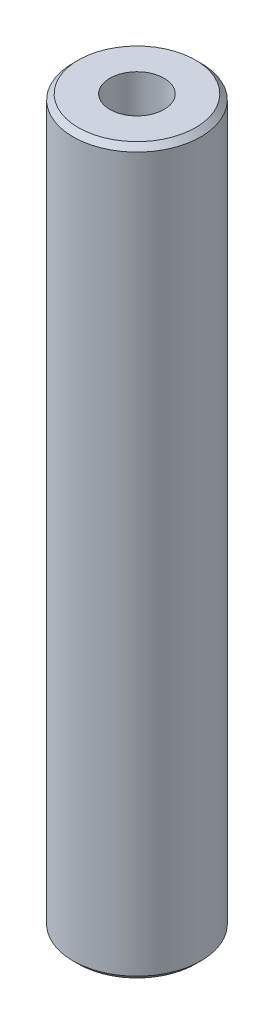
ISO-10303-21;
HEADER;
FILE_DESCRIPTION(('STEP AP214'),'2;1');
FILE_NAME('part.step','',(''),(''),'','','');
FILE_SCHEMA(('AUTOMOTIVE_DESIGN { 1 0 10303 214 1 1 1 1 }'));
ENDSEC;
DATA;
#1=APPLICATION_CONTEXT('core data for automotive mechanical design processes');
#2=APPLICATION_PROTOCOL_DEFINITION('international standard','automotive_design',2000,#1);
#3=PRODUCT_CONTEXT('',#1,'mechanical');
#4=PRODUCT('Part','Part','',(#3));
#5=PRODUCT_RELATED_PRODUCT_CATEGORY('part','',(#4));
#6=PRODUCT_DEFINITION_FORMATION('','',#4);
#7=PRODUCT_DEFINITION_CONTEXT('part definition',#1,'design');
#8=PRODUCT_DEFINITION('design','',#6,#7);
#9=PRODUCT_DEFINITION_SHAPE('','',#8);
#10=(LENGTH_UNIT() NAMED_UNIT(*) SI_UNIT(.MILLI.,.METRE.));
#11=(NAMED_UNIT(*) PLANE_ANGLE_UNIT() SI_UNIT($,.RADIAN.));
#12=(NAMED_UNIT(*) SI_UNIT($,.STERADIAN.) SOLID_ANGLE_UNIT());
#13=UNCERTAINTY_MEASURE_WITH_UNIT(LENGTH_MEASURE(1.E-05),#10,'distance_accuracy_value','');
#14=(GEOMETRIC_REPRESENTATION_CONTEXT(3) GLOBAL_UNCERTAINTY_ASSIGNED_CONTEXT((#13)) GLOBAL_UNIT_ASSIGNED_CONTEXT((#10,
#11,#12)) REPRESENTATION_CONTEXT('',''));
#15=CARTESIAN_POINT('',(0.,0.,0.));
#16=DIRECTION('',(0.,0.,1.));
#17=DIRECTION('',(1.,0.,0.));
#18=AXIS2_PLACEMENT_3D('',#15,#16,#17);
#19=CARTESIAN_POINT('',(0.,26.9875,0.));
#20=DIRECTION('',(0.,-1.,0.));
#21=DIRECTION('',(0.,0.,-1.));
#22=AXIS2_PLACEMENT_3D('',#19,#20,#21);
#23=CYLINDRICAL_SURFACE('',#22,4.7625);
#24=CARTESIAN_POINT('',(0.,-26.590625,0.));
#25=DIRECTION('',(0.,1.,0.));
#26=DIRECTION('',(0.,0.,1.));
#27=AXIS2_PLACEMENT_3D('',#24,#25,#26);
#28=CIRCLE('',#27,4.7625);
#29=CARTESIAN_POINT('',(0.,-26.590625,4.7625));
#30=VERTEX_POINT('',#29);
#31=EDGE_CURVE('E45',#30,#30,#28,.T.);
#32=ORIENTED_EDGE('',*,*,#31,.T.);
#33=EDGE_LOOP('',(#32));
#34=FACE_BOUND('',#33,.T.);
#35=CARTESIAN_POINT('',(0.,26.590625,0.));
#36=DIRECTION('',(0.,1.,0.));
#37=DIRECTION('',(0.,0.,1.));
#38=AXIS2_PLACEMENT_3D('',#35,#36,#37);
#39=CIRCLE('',#38,4.7625);
#40=CARTESIAN_POINT('',(0.,26.590625,4.7625));
#41=VERTEX_POINT('',#40);
#42=EDGE_CURVE('E49',#41,#41,#39,.F.);
#43=ORIENTED_EDGE('',*,*,#42,.T.);
#44=EDGE_LOOP('',(#43));
#45=FACE_BOUND('',#44,.T.);
#46=ADVANCED_FACE('F33',(#34,#45),#23,.T.);
#47=CARTESIAN_POINT('',(0.,26.9875,0.));
#48=DIRECTION('',(0.,1.,0.));
#49=DIRECTION('',(0.,0.,1.));
#50=AXIS2_PLACEMENT_3D('',#47,#48,#49);
#51=PLANE('',#50);
#52=CARTESIAN_POINT('',(0.,26.9875,0.));
#53=DIRECTION('',(0.,1.,0.));
#54=DIRECTION('',(0.,0.,1.));
#55=AXIS2_PLACEMENT_3D('',#52,#53,#54);
#56=CIRCLE('',#55,2.0193);
#57=CARTESIAN_POINT('',(0.,26.9875,2.0193));
#58=VERTEX_POINT('',#57);
#59=EDGE_CURVE('E55',#58,#58,#56,.T.);
#60=ORIENTED_EDGE('',*,*,#59,.F.);
#61=EDGE_LOOP('',(#60));
#62=FACE_BOUND('',#61,.T.);
#63=CARTESIAN_POINT('',(0.,26.9875,0.));
#64=DIRECTION('',(0.,1.,0.));
#65=DIRECTION('',(0.,0.,1.));
#66=AXIS2_PLACEMENT_3D('',#63,#64,#65);
#67=CIRCLE('',#66,4.36562499999998);
#68=CARTESIAN_POINT('',(0.,26.9875,4.36562499999998));
#69=VERTEX_POINT('',#68);
#70=EDGE_CURVE('E10',#69,#69,#67,.T.);
#71=ORIENTED_EDGE('',*,*,#70,.T.);
#72=EDGE_LOOP('',(#71));
#73=FACE_BOUND('',#72,.T.);
#74=ADVANCED_FACE('F79',(#62,#73),#51,.T.);
#75=CARTESIAN_POINT('',(0.,-26.9875,0.));
#76=DIRECTION('',(0.,1.,0.));
#77=DIRECTION('',(0.,0.,1.));
#78=AXIS2_PLACEMENT_3D('',#75,#76,#77);
#79=PLANE('',#78);
#80=CARTESIAN_POINT('',(0.,-26.9875,0.));
#81=DIRECTION('',(0.,1.,0.));
#82=DIRECTION('',(0.,0.,1.));
#83=AXIS2_PLACEMENT_3D('',#80,#81,#82);
#84=CIRCLE('',#83,2.0193);
#85=CARTESIAN_POINT('',(0.,-26.9875,-2.0193));
#86=VERTEX_POINT('',#85);
#87=EDGE_CURVE('E61',#86,#86,#84,.T.);
#88=ORIENTED_EDGE('',*,*,#87,.T.);
#89=EDGE_LOOP('',(#88));
#90=FACE_BOUND('',#89,.T.);
#91=CARTESIAN_POINT('',(0.,-26.9875,0.));
#92=DIRECTION('',(0.,1.,0.));
#93=DIRECTION('',(0.,0.,1.));
#94=AXIS2_PLACEMENT_3D('',#91,#92,#93);
#95=CIRCLE('',#94,4.36562499999999);
#96=CARTESIAN_POINT('',(0.,-26.9875,4.36562499999999));
#97=VERTEX_POINT('',#96);
#98=EDGE_CURVE('E41',#97,#97,#95,.F.);
#99=ORIENTED_EDGE('',*,*,#98,.T.);
#100=EDGE_LOOP('',(#99));
#101=FACE_BOUND('',#100,.T.);
#102=ADVANCED_FACE('F85',(#90,#101),#79,.F.);
#103=CARTESIAN_POINT('',(0.,-26.590625,0.));
#104=DIRECTION('',(0.,1.,0.));
#105=DIRECTION('',(0.,0.,1.));
#106=AXIS2_PLACEMENT_3D('',#103,#104,#105);
#107=CONICAL_SURFACE('',#106,4.7625,0.785398163397454);
#108=ORIENTED_EDGE('',*,*,#98,.F.);
#109=EDGE_LOOP('',(#108));
#110=FACE_BOUND('',#109,.T.);
#111=ORIENTED_EDGE('',*,*,#31,.F.);
#112=EDGE_LOOP('',(#111));
#113=FACE_BOUND('',#112,.T.);
#114=ADVANCED_FACE('F91',(#110,#113),#107,.T.);
#115=CARTESIAN_POINT('',(0.,26.9875,0.));
#116=DIRECTION('',(0.,-1.,0.));
#117=DIRECTION('',(0.,0.,-1.));
#118=AXIS2_PLACEMENT_3D('',#115,#116,#117);
#119=CONICAL_SURFACE('',#118,4.36562499999998,0.785398163397445);
#120=ORIENTED_EDGE('',*,*,#42,.F.);
#121=EDGE_LOOP('',(#120));
#122=FACE_BOUND('',#121,.T.);
#123=ORIENTED_EDGE('',*,*,#70,.F.);
#124=EDGE_LOOP('',(#123));
#125=FACE_BOUND('',#124,.T.);
#126=ADVANCED_FACE('F36',(#122,#125),#119,.T.);
#127=CARTESIAN_POINT('',(0.,7.9375,0.));
#128=DIRECTION('',(0.,1.,0.));
#129=DIRECTION('',(0.,0.,1.));
#130=AXIS2_PLACEMENT_3D('',#127,#128,#129);
#131=CYLINDRICAL_SURFACE('',#130,2.0193);
#132=CARTESIAN_POINT('',(0.,7.9375,0.));
#133=DIRECTION('',(0.,1.,0.));
#134=DIRECTION('',(0.,0.,1.));
#135=AXIS2_PLACEMENT_3D('',#132,#133,#134);
#136=CIRCLE('',#135,2.0193);
#137=CARTESIAN_POINT('',(0.,7.9375,2.0193));
#138=VERTEX_POINT('',#137);
#139=EDGE_CURVE('E54',#138,#138,#136,.T.);
#140=CARTESIAN_POINT('',(0.,7.9375,2.0193));
#141=CARTESIAN_POINT('',(0.,8.1359375,2.0193));
#142=CARTESIAN_POINT('',(0.,8.334375,2.0193));
#143=CARTESIAN_POINT('',(0.,8.73125,2.0193));
#144=CARTESIAN_POINT('',(0.,8.92968749999999,2.0193));
#145=CARTESIAN_POINT('',(0.,9.3265625,2.0193));
#146=CARTESIAN_POINT('',(0.,9.525,2.0193));
#147=CARTESIAN_POINT('',(0.,9.921875,2.0193));
#148=CARTESIAN_POINT('',(0.,10.1203125,2.0193));
#149=CARTESIAN_POINT('',(0.,10.5171875,2.0193));
#150=CARTESIAN_POINT('',(0.,10.715625,2.0193));
#151=CARTESIAN_POINT('',(0.,11.1125,2.0193));
#152=CARTESIAN_POINT('',(0.,11.3109375,2.0193));
#153=CARTESIAN_POINT('',(0.,11.7078125,2.0193));
#154=CARTESIAN_POINT('',(0.,11.90625,2.0193));
#155=CARTESIAN_POINT('',(0.,12.303125,2.0193));
#156=CARTESIAN_POINT('',(0.,12.5015625,2.0193));
#157=CARTESIAN_POINT('',(0.,12.8984375,2.0193));
#158=CARTESIAN_POINT('',(0.,13.096875,2.0193));
#159=CARTESIAN_POINT('',(0.,13.49375,2.0193));
#160=CARTESIAN_POINT('',(0.,13.6921875,2.0193));
#161=CARTESIAN_POINT('',(0.,14.0890625,2.0193));
#162=CARTESIAN_POINT('',(0.,14.2875,2.0193));
#163=CARTESIAN_POINT('',(0.,14.684375,2.0193));
#164=CARTESIAN_POINT('',(0.,14.8828125,2.0193));
#165=CARTESIAN_POINT('',(0.,15.2796875,2.0193));
#166=CARTESIAN_POINT('',(0.,15.478125,2.0193));
#167=CARTESIAN_POINT('',(0.,15.875,2.0193));
#168=CARTESIAN_POINT('',(0.,16.0734375,2.0193));
#169=CARTESIAN_POINT('',(0.,16.4703125,2.0193));
#170=CARTESIAN_POINT('',(0.,16.66875,2.0193));
#171=CARTESIAN_POINT('',(0.,17.065625,2.0193));
#172=CARTESIAN_POINT('',(0.,17.2640625,2.0193));
#173=CARTESIAN_POINT('',(0.,17.6609375,2.0193));
#174=CARTESIAN_POINT('',(0.,17.859375,2.0193));
#175=CARTESIAN_POINT('',(0.,18.25625,2.0193));
#176=CARTESIAN_POINT('',(0.,18.4546875,2.0193));
#177=CARTESIAN_POINT('',(0.,18.8515625,2.0193));
#178=CARTESIAN_POINT('',(0.,19.05,2.0193));
#179=CARTESIAN_POINT('',(0.,19.446875,2.0193));
#180=CARTESIAN_POINT('',(0.,19.6453125,2.0193));
#181=CARTESIAN_POINT('',(0.,20.0421875,2.0193));
#182=CARTESIAN_POINT('',(0.,20.240625,2.0193));
#183=CARTESIAN_POINT('',(0.,20.6375,2.0193));
#184=CARTESIAN_POINT('',(0.,20.8359375,2.0193));
#185=CARTESIAN_POINT('',(0.,21.2328125,2.0193));
#186=CARTESIAN_POINT('',(0.,21.43125,2.0193));
#187=CARTESIAN_POINT('',(0.,21.828125,2.0193));
#188=CARTESIAN_POINT('',(0.,22.0265625,2.0193));
#189=CARTESIAN_POINT('',(0.,22.4234375,2.0193));
#190=CARTESIAN_POINT('',(0.,22.621875,2.0193));
#191=CARTESIAN_POINT('',(0.,23.01875,2.0193));
#192=CARTESIAN_POINT('',(0.,23.2171875,2.0193));
#193=CARTESIAN_POINT('',(0.,23.6140625,2.0193));
#194=CARTESIAN_POINT('',(0.,23.8125,2.0193));
#195=CARTESIAN_POINT('',(0.,24.209375,2.0193));
#196=CARTESIAN_POINT('',(0.,24.4078125,2.0193));
#197=CARTESIAN_POINT('',(0.,24.8046875,2.0193));
#198=CARTESIAN_POINT('',(0.,25.003125,2.0193));
#199=CARTESIAN_POINT('',(0.,25.4,2.0193));
#200=CARTESIAN_POINT('',(0.,25.5984375,2.0193));
#201=CARTESIAN_POINT('',(0.,25.9953125,2.0193));
#202=CARTESIAN_POINT('',(0.,26.19375,2.0193));
#203=CARTESIAN_POINT('',(0.,26.590625,2.0193));
#204=CARTESIAN_POINT('',(0.,26.7890625,2.0193));
#205=CARTESIAN_POINT('',(0.,26.9875,2.0193));
#206=B_SPLINE_CURVE_WITH_KNOTS('',3,(#140,#141,#142,#143,#144,#145,#146,#147,#148,#149,#150,
#151,#152,#153,#154,#155,#156,#157,#158,#159,#160,#161,#162,#163,#164,#165,#166,#167,#168,#169,
#170,#171,#172,#173,#174,#175,#176,#177,#178,#179,#180,#181,#182,#183,#184,#185,#186,#187,#188,
#189,#190,#191,#192,#193,#194,#195,#196,#197,#198,#199,#200,#201,#202,#203,#204,#205),
.UNSPECIFIED.,.F.,.F.,(4,2,2,2,2,2,2,2,2,2,2,2,2,2,2,2,2,2,2,2,2,2,2,2,2,2,2,2,2,2,2,2,4),(0.,
0.595312499999999,1.190625,1.7859375,2.38125,2.9765625,3.571875,4.1671875,4.7625,5.3578125,
5.953125,6.5484375,7.14375,7.7390625,8.334375,8.9296875,9.525,10.1203125,10.715625,11.3109375,
11.90625,12.5015625,13.096875,13.6921875,14.2875,14.8828125,15.478125,16.0734375,16.66875,
17.2640625,17.859375,18.4546875,19.05),.UNSPECIFIED.);
#207=EDGE_CURVE('BSEAM100',#138,#58,#206,.T.);
#208=ORIENTED_EDGE('',*,*,#139,.F.);
#209=ORIENTED_EDGE('',*,*,#59,.T.);
#210=ORIENTED_EDGE('',*,*,#207,.T.);
#211=ORIENTED_EDGE('',*,*,#207,.F.);
#212=EDGE_LOOP('',(#208,#210,#209,#211));
#213=FACE_BOUND('',#212,.T.);
#214=ADVANCED_FACE('F100',(#213),#131,.F.);
#215=CARTESIAN_POINT('',(0.,7.9375,0.));
#216=DIRECTION('',(0.,1.,0.));
#217=DIRECTION('',(0.,0.,1.));
#218=AXIS2_PLACEMENT_3D('',#215,#216,#217);
#219=PLANE('',#218);
#220=ORIENTED_EDGE('',*,*,#139,.T.);
#221=EDGE_LOOP('',(#220));
#222=FACE_BOUND('',#221,.T.);
#223=ADVANCED_FACE('F76',(#222),#219,.T.);
#224=CARTESIAN_POINT('',(0.,-7.9375,0.));
#225=DIRECTION('',(0.,-1.,0.));
#226=DIRECTION('',(0.,0.,-1.));
#227=AXIS2_PLACEMENT_3D('',#224,#225,#226);
#228=CYLINDRICAL_SURFACE('',#227,2.0193);
#229=CARTESIAN_POINT('',(0.,-7.9375,0.));
#230=DIRECTION('',(0.,1.,0.));
#231=DIRECTION('',(0.,0.,1.));
#232=AXIS2_PLACEMENT_3D('',#229,#230,#231);
#233=CIRCLE('',#232,2.0193);
#234=CARTESIAN_POINT('',(0.,-7.9375,-2.0193));
#235=VERTEX_POINT('',#234);
#236=EDGE_CURVE('E58',#235,#235,#233,.T.);
#237=CARTESIAN_POINT('',(0.,-7.9375,-2.0193));
#238=CARTESIAN_POINT('',(0.,-8.1359375,-2.0193));
#239=CARTESIAN_POINT('',(0.,-8.334375,-2.0193));
#240=CARTESIAN_POINT('',(0.,-8.73125,-2.0193));
#241=CARTESIAN_POINT('',(0.,-8.9296875,-2.0193));
#242=CARTESIAN_POINT('',(0.,-9.3265625,-2.0193));
#243=CARTESIAN_POINT('',(0.,-9.525,-2.0193));
#244=CARTESIAN_POINT('',(0.,-9.921875,-2.0193));
#245=CARTESIAN_POINT('',(0.,-10.1203125,-2.0193));
#246=CARTESIAN_POINT('',(0.,-10.5171875,-2.0193));
#247=CARTESIAN_POINT('',(0.,-10.715625,-2.0193));
#248=CARTESIAN_POINT('',(0.,-11.1125,-2.0193));
#249=CARTESIAN_POINT('',(0.,-11.3109375,-2.0193));
#250=CARTESIAN_POINT('',(0.,-11.7078125,-2.0193));
#251=CARTESIAN_POINT('',(0.,-11.90625,-2.0193));
#252=CARTESIAN_POINT('',(0.,-12.303125,-2.0193));
#253=CARTESIAN_POINT('',(0.,-12.5015625,-2.0193));
#254=CARTESIAN_POINT('',(0.,-12.8984375,-2.0193));
#255=CARTESIAN_POINT('',(0.,-13.096875,-2.0193));
#256=CARTESIAN_POINT('',(0.,-13.49375,-2.0193));
#257=CARTESIAN_POINT('',(0.,-13.6921875,-2.0193));
#258=CARTESIAN_POINT('',(0.,-14.0890625,-2.0193));
#259=CARTESIAN_POINT('',(0.,-14.2875,-2.0193));
#260=CARTESIAN_POINT('',(0.,-14.684375,-2.0193));
#261=CARTESIAN_POINT('',(0.,-14.8828125,-2.0193));
#262=CARTESIAN_POINT('',(0.,-15.2796875,-2.0193));
#263=CARTESIAN_POINT('',(0.,-15.478125,-2.0193));
#264=CARTESIAN_POINT('',(0.,-15.875,-2.0193));
#265=CARTESIAN_POINT('',(0.,-16.0734375,-2.0193));
#266=CARTESIAN_POINT('',(0.,-16.4703125,-2.0193));
#267=CARTESIAN_POINT('',(0.,-16.66875,-2.0193));
#268=CARTESIAN_POINT('',(0.,-17.065625,-2.0193));
#269=CARTESIAN_POINT('',(0.,-17.2640625,-2.0193));
#270=CARTESIAN_POINT('',(0.,-17.6609375,-2.0193));
#271=CARTESIAN_POINT('',(0.,-17.859375,-2.0193));
#272=CARTESIAN_POINT('',(0.,-18.25625,-2.0193));
#273=CARTESIAN_POINT('',(0.,-18.4546875,-2.0193));
#274=CARTESIAN_POINT('',(0.,-18.8515625,-2.0193));
#275=CARTESIAN_POINT('',(0.,-19.05,-2.0193));
#276=CARTESIAN_POINT('',(0.,-19.446875,-2.0193));
#277=CARTESIAN_POINT('',(0.,-19.6453125,-2.0193));
#278=CARTESIAN_POINT('',(0.,-20.0421875,-2.0193));
#279=CARTESIAN_POINT('',(0.,-20.240625,-2.0193));
#280=CARTESIAN_POINT('',(0.,-20.6375,-2.0193));
#281=CARTESIAN_POINT('',(0.,-20.8359375,-2.0193));
#282=CARTESIAN_POINT('',(0.,-21.2328125,-2.0193));
#283=CARTESIAN_POINT('',(0.,-21.43125,-2.0193));
#284=CARTESIAN_POINT('',(0.,-21.828125,-2.0193));
#285=CARTESIAN_POINT('',(0.,-22.0265625,-2.0193));
#286=CARTESIAN_POINT('',(0.,-22.4234375,-2.0193));
#287=CARTESIAN_POINT('',(0.,-22.621875,-2.0193));
#288=CARTESIAN_POINT('',(0.,-23.01875,-2.0193));
#289=CARTESIAN_POINT('',(0.,-23.2171875,-2.0193));
#290=CARTESIAN_POINT('',(0.,-23.6140625,-2.0193));
#291=CARTESIAN_POINT('',(0.,-23.8125,-2.0193));
#292=CARTESIAN_POINT('',(0.,-24.209375,-2.0193));
#293=CARTESIAN_POINT('',(0.,-24.4078125,-2.0193));
#294=CARTESIAN_POINT('',(0.,-24.8046875,-2.0193));
#295=CARTESIAN_POINT('',(0.,-25.003125,-2.0193));
#296=CARTESIAN_POINT('',(0.,-25.4,-2.0193));
#297=CARTESIAN_POINT('',(0.,-25.5984375,-2.0193));
#298=CARTESIAN_POINT('',(0.,-25.9953125,-2.0193));
#299=CARTESIAN_POINT('',(0.,-26.19375,-2.0193));
#300=CARTESIAN_POINT('',(0.,-26.590625,-2.0193));
#301=CARTESIAN_POINT('',(0.,-26.7890625,-2.0193));
#302=CARTESIAN_POINT('',(0.,-26.9875,-2.0193));
#303=B_SPLINE_CURVE_WITH_KNOTS('',3,(#237,#238,#239,#240,#241,#242,#243,#244,#245,#246,#247,
#248,#249,#250,#251,#252,#253,#254,#255,#256,#257,#258,#259,#260,#261,#262,#263,#264,#265,#266,
#267,#268,#269,#270,#271,#272,#273,#274,#275,#276,#277,#278,#279,#280,#281,#282,#283,#284,#285,
#286,#287,#288,#289,#290,#291,#292,#293,#294,#295,#296,#297,#298,#299,#300,#301,#302),
.UNSPECIFIED.,.F.,.F.,(4,2,2,2,2,2,2,2,2,2,2,2,2,2,2,2,2,2,2,2,2,2,2,2,2,2,2,2,2,2,2,2,4),(0.,
0.595312499999999,1.190625,1.7859375,2.38125,2.9765625,3.571875,4.1671875,4.7625,5.3578125,
5.953125,6.5484375,7.14375,7.7390625,8.334375,8.9296875,9.525,10.1203125,10.715625,11.3109375,
11.90625,12.5015625,13.096875,13.6921875,14.2875,14.8828125,15.478125,16.0734375,16.66875,
17.2640625,17.859375,18.4546875,19.05),.UNSPECIFIED.);
#304=EDGE_CURVE('BSEAM67',#235,#86,#303,.T.);
#305=ORIENTED_EDGE('',*,*,#236,.T.);
#306=ORIENTED_EDGE('',*,*,#87,.F.);
#307=ORIENTED_EDGE('',*,*,#304,.T.);
#308=ORIENTED_EDGE('',*,*,#304,.F.);
#309=EDGE_LOOP('',(#305,#307,#306,#308));
#310=FACE_BOUND('',#309,.T.);
#311=ADVANCED_FACE('F67',(#310),#228,.F.);
#312=CARTESIAN_POINT('',(0.,-7.9375,0.));
#313=DIRECTION('',(0.,1.,0.));
#314=DIRECTION('',(0.,0.,1.));
#315=AXIS2_PLACEMENT_3D('',#312,#313,#314);
#316=PLANE('',#315);
#317=ORIENTED_EDGE('',*,*,#236,.F.);
#318=EDGE_LOOP('',(#317));
#319=FACE_BOUND('',#318,.T.);
#320=ADVANCED_FACE('F70',(#319),#316,.F.);
#321=CLOSED_SHELL('',(#46,#74,#102,#114,#126,#214,#223,#311,#320));
#322=MANIFOLD_SOLID_BREP('B2',#321);
#323=ADVANCED_BREP_SHAPE_REPRESENTATION('',(#18,#322),#14);
#324=SHAPE_DEFINITION_REPRESENTATION(#9,#323);
ENDSEC;
END-ISO-10303-21;
